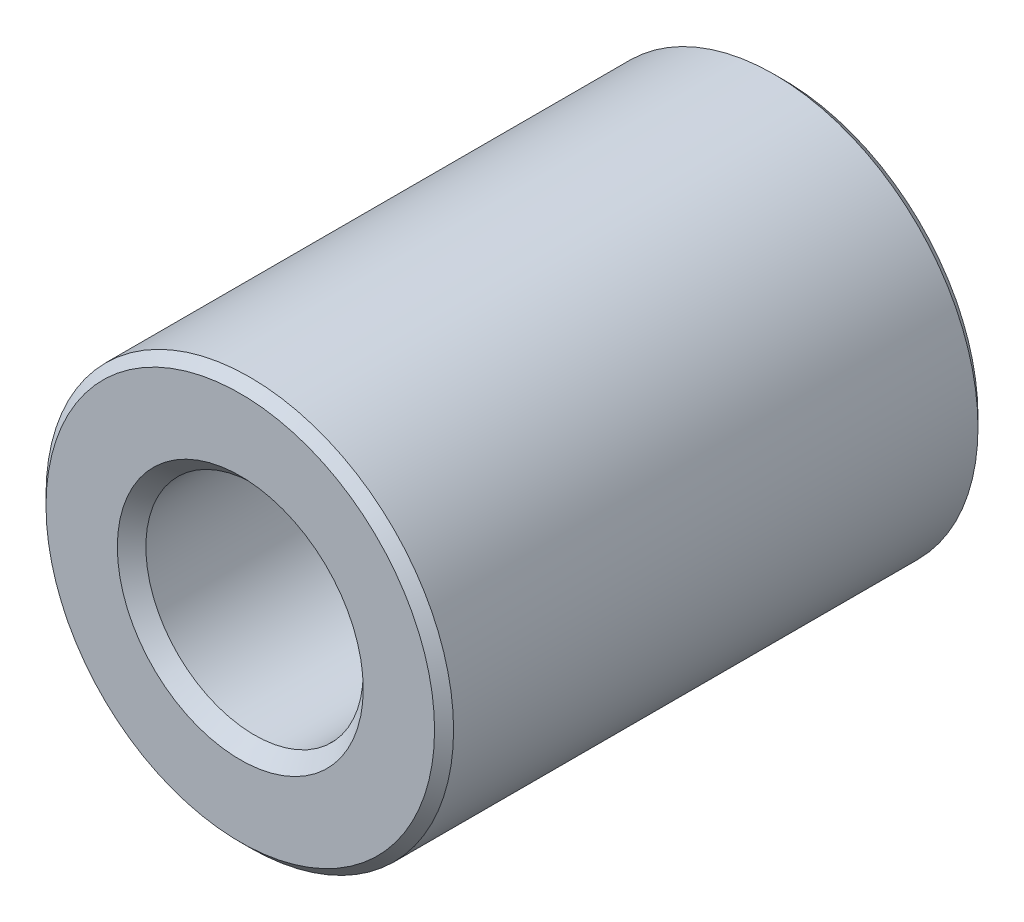
ISO-10303-21;
HEADER;
FILE_DESCRIPTION(('STEP AP214'),'2;1');
FILE_NAME('part.step','',(''),(''),'','','');
FILE_SCHEMA(('AUTOMOTIVE_DESIGN { 1 0 10303 214 1 1 1 1 }'));
ENDSEC;
DATA;
#1=APPLICATION_CONTEXT('core data for automotive mechanical design processes');
#2=APPLICATION_PROTOCOL_DEFINITION('international standard','automotive_design',2000,#1);
#3=PRODUCT_CONTEXT('',#1,'mechanical');
#4=PRODUCT('Part','Part','',(#3));
#5=PRODUCT_RELATED_PRODUCT_CATEGORY('part','',(#4));
#6=PRODUCT_DEFINITION_FORMATION('','',#4);
#7=PRODUCT_DEFINITION_CONTEXT('part definition',#1,'design');
#8=PRODUCT_DEFINITION('design','',#6,#7);
#9=PRODUCT_DEFINITION_SHAPE('','',#8);
#10=(LENGTH_UNIT() NAMED_UNIT(*) SI_UNIT(.MILLI.,.METRE.));
#11=(NAMED_UNIT(*) PLANE_ANGLE_UNIT() SI_UNIT($,.RADIAN.));
#12=(NAMED_UNIT(*) SI_UNIT($,.STERADIAN.) SOLID_ANGLE_UNIT());
#13=UNCERTAINTY_MEASURE_WITH_UNIT(LENGTH_MEASURE(1.E-05),#10,'distance_accuracy_value','');
#14=(GEOMETRIC_REPRESENTATION_CONTEXT(3) GLOBAL_UNCERTAINTY_ASSIGNED_CONTEXT((#13)) GLOBAL_UNIT_ASSIGNED_CONTEXT((#10,
#11,#12)) REPRESENTATION_CONTEXT('',''));
#15=CARTESIAN_POINT('',(0.,0.,0.));
#16=DIRECTION('',(0.,0.,1.));
#17=DIRECTION('',(1.,0.,0.));
#18=AXIS2_PLACEMENT_3D('',#15,#16,#17);
#19=CARTESIAN_POINT('',(0.,0.,-4.));
#20=DIRECTION('',(0.,0.,1.));
#21=DIRECTION('',(1.,0.,0.));
#22=AXIS2_PLACEMENT_3D('',#19,#20,#21);
#23=CYLINDRICAL_SURFACE('',#22,3.);
#24=CARTESIAN_POINT('',(0.,0.,3.86));
#25=DIRECTION('',(0.,0.,1.));
#26=DIRECTION('',(1.,0.,0.));
#27=AXIS2_PLACEMENT_3D('',#24,#25,#26);
#28=CIRCLE('',#27,3.);
#29=CARTESIAN_POINT('',(-3.,0.,3.86));
#30=VERTEX_POINT('',#29);
#31=EDGE_CURVE('E55',#30,#30,#28,.F.);
#32=ORIENTED_EDGE('',*,*,#31,.T.);
#33=EDGE_LOOP('',(#32));
#34=FACE_BOUND('',#33,.T.);
#35=CARTESIAN_POINT('',(0.,0.,-3.86));
#36=DIRECTION('',(0.,0.,1.));
#37=DIRECTION('',(1.,0.,0.));
#38=AXIS2_PLACEMENT_3D('',#35,#36,#37);
#39=CIRCLE('',#38,3.);
#40=CARTESIAN_POINT('',(3.,0.,-3.86));
#41=VERTEX_POINT('',#40);
#42=EDGE_CURVE('E58',#41,#41,#39,.T.);
#43=ORIENTED_EDGE('',*,*,#42,.T.);
#44=EDGE_LOOP('',(#43));
#45=FACE_BOUND('',#44,.T.);
#46=ADVANCED_FACE('F32',(#34,#45),#23,.T.);
#47=CARTESIAN_POINT('',(0.,0.,-4.));
#48=DIRECTION('',(0.,0.,1.));
#49=DIRECTION('',(1.,0.,0.));
#50=AXIS2_PLACEMENT_3D('',#47,#48,#49);
#51=PLANE('',#50);
#52=CARTESIAN_POINT('',(0.,0.,-4.));
#53=DIRECTION('',(0.,0.,1.));
#54=DIRECTION('',(1.,0.,0.));
#55=AXIS2_PLACEMENT_3D('',#52,#53,#54);
#56=CIRCLE('',#55,1.81);
#57=CARTESIAN_POINT('',(1.81,0.,-4.));
#58=VERTEX_POINT('',#57);
#59=EDGE_CURVE('E10',#58,#58,#56,.T.);
#60=ORIENTED_EDGE('',*,*,#59,.T.);
#61=EDGE_LOOP('',(#60));
#62=FACE_BOUND('',#61,.T.);
#63=CARTESIAN_POINT('',(0.,0.,-4.));
#64=DIRECTION('',(0.,0.,1.));
#65=DIRECTION('',(1.,0.,0.));
#66=AXIS2_PLACEMENT_3D('',#63,#64,#65);
#67=CIRCLE('',#66,2.86);
#68=CARTESIAN_POINT('',(2.86,0.,-4.));
#69=VERTEX_POINT('',#68);
#70=EDGE_CURVE('E52',#69,#69,#67,.F.);
#71=ORIENTED_EDGE('',*,*,#70,.T.);
#72=EDGE_LOOP('',(#71));
#73=FACE_BOUND('',#72,.T.);
#74=ADVANCED_FACE('F84',(#62,#73),#51,.F.);
#75=CARTESIAN_POINT('',(0.,0.,-4.));
#76=DIRECTION('',(0.,0.,1.));
#77=DIRECTION('',(1.,0.,0.));
#78=AXIS2_PLACEMENT_3D('',#75,#76,#77);
#79=CYLINDRICAL_SURFACE('',#78,1.6);
#80=CARTESIAN_POINT('',(0.,0.,3.79));
#81=DIRECTION('',(0.,0.,1.));
#82=DIRECTION('',(1.,0.,0.));
#83=AXIS2_PLACEMENT_3D('',#80,#81,#82);
#84=CIRCLE('',#83,1.6);
#85=CARTESIAN_POINT('',(1.6,0.,3.79));
#86=VERTEX_POINT('',#85);
#87=EDGE_CURVE('E43',#86,#86,#84,.T.);
#88=ORIENTED_EDGE('',*,*,#87,.T.);
#89=EDGE_LOOP('',(#88));
#90=FACE_BOUND('',#89,.T.);
#91=CARTESIAN_POINT('',(0.,0.,-3.79));
#92=DIRECTION('',(0.,0.,1.));
#93=DIRECTION('',(1.,0.,0.));
#94=AXIS2_PLACEMENT_3D('',#91,#92,#93);
#95=CIRCLE('',#94,1.6);
#96=CARTESIAN_POINT('',(1.6,0.,-3.79));
#97=VERTEX_POINT('',#96);
#98=EDGE_CURVE('E47',#97,#97,#95,.F.);
#99=ORIENTED_EDGE('',*,*,#98,.T.);
#100=EDGE_LOOP('',(#99));
#101=FACE_BOUND('',#100,.T.);
#102=ADVANCED_FACE('F79',(#90,#101),#79,.F.);
#103=CARTESIAN_POINT('',(0.,0.,4.));
#104=DIRECTION('',(0.,0.,1.));
#105=DIRECTION('',(1.,0.,0.));
#106=AXIS2_PLACEMENT_3D('',#103,#104,#105);
#107=PLANE('',#106);
#108=CARTESIAN_POINT('',(0.,0.,4.));
#109=DIRECTION('',(0.,0.,1.));
#110=DIRECTION('',(1.,0.,0.));
#111=AXIS2_PLACEMENT_3D('',#108,#109,#110);
#112=CIRCLE('',#111,1.81);
#113=CARTESIAN_POINT('',(1.81,0.,4.));
#114=VERTEX_POINT('',#113);
#115=EDGE_CURVE('E39',#114,#114,#112,.F.);
#116=ORIENTED_EDGE('',*,*,#115,.T.);
#117=EDGE_LOOP('',(#116));
#118=FACE_BOUND('',#117,.T.);
#119=CARTESIAN_POINT('',(0.,0.,4.));
#120=DIRECTION('',(0.,0.,1.));
#121=DIRECTION('',(1.,0.,0.));
#122=AXIS2_PLACEMENT_3D('',#119,#120,#121);
#123=CIRCLE('',#122,2.86);
#124=CARTESIAN_POINT('',(-2.86,0.,4.));
#125=VERTEX_POINT('',#124);
#126=EDGE_CURVE('E61',#125,#125,#123,.T.);
#127=ORIENTED_EDGE('',*,*,#126,.T.);
#128=EDGE_LOOP('',(#127));
#129=FACE_BOUND('',#128,.T.);
#130=ADVANCED_FACE('F65',(#118,#129),#107,.T.);
#131=CARTESIAN_POINT('',(0.,0.,4.));
#132=DIRECTION('',(0.,0.,-1.));
#133=DIRECTION('',(-1.,0.,0.));
#134=AXIS2_PLACEMENT_3D('',#131,#132,#133);
#135=CONICAL_SURFACE('',#134,2.86,0.785398163397439);
#136=CARTESIAN_POINT('',(-3.,0.,3.86));
#137=CARTESIAN_POINT('',(-2.99854166666667,0.,3.86145833333333));
#138=CARTESIAN_POINT('',(-2.99708333333333,0.,3.86291666666667));
#139=CARTESIAN_POINT('',(-2.99416666666667,0.,3.86583333333333));
#140=CARTESIAN_POINT('',(-2.99270833333333,0.,3.86729166666667));
#141=CARTESIAN_POINT('',(-2.98979166666667,0.,3.87020833333333));
#142=CARTESIAN_POINT('',(-2.98833333333333,0.,3.87166666666667));
#143=CARTESIAN_POINT('',(-2.98541666666667,0.,3.87458333333333));
#144=CARTESIAN_POINT('',(-2.98395833333333,0.,3.87604166666667));
#145=CARTESIAN_POINT('',(-2.98104166666667,0.,3.87895833333333));
#146=CARTESIAN_POINT('',(-2.97958333333333,0.,3.88041666666667));
#147=CARTESIAN_POINT('',(-2.97666666666667,0.,3.88333333333333));
#148=CARTESIAN_POINT('',(-2.97520833333333,0.,3.88479166666667));
#149=CARTESIAN_POINT('',(-2.97229166666667,0.,3.88770833333333));
#150=CARTESIAN_POINT('',(-2.97083333333333,0.,3.88916666666667));
#151=CARTESIAN_POINT('',(-2.96791666666667,0.,3.89208333333333));
#152=CARTESIAN_POINT('',(-2.96645833333333,0.,3.89354166666667));
#153=CARTESIAN_POINT('',(-2.96354166666667,0.,3.89645833333333));
#154=CARTESIAN_POINT('',(-2.96208333333333,0.,3.89791666666667));
#155=CARTESIAN_POINT('',(-2.95916666666667,0.,3.90083333333333));
#156=CARTESIAN_POINT('',(-2.95770833333333,0.,3.90229166666667));
#157=CARTESIAN_POINT('',(-2.95479166666667,0.,3.90520833333333));
#158=CARTESIAN_POINT('',(-2.95333333333333,0.,3.90666666666667));
#159=CARTESIAN_POINT('',(-2.95041666666667,0.,3.90958333333333));
#160=CARTESIAN_POINT('',(-2.94895833333333,0.,3.91104166666667));
#161=CARTESIAN_POINT('',(-2.94604166666667,0.,3.91395833333333));
#162=CARTESIAN_POINT('',(-2.94458333333333,0.,3.91541666666667));
#163=CARTESIAN_POINT('',(-2.94166666666667,0.,3.91833333333333));
#164=CARTESIAN_POINT('',(-2.94020833333333,0.,3.91979166666667));
#165=CARTESIAN_POINT('',(-2.93729166666667,0.,3.92270833333333));
#166=CARTESIAN_POINT('',(-2.93583333333333,0.,3.92416666666667));
#167=CARTESIAN_POINT('',(-2.93291666666667,0.,3.92708333333333));
#168=CARTESIAN_POINT('',(-2.93145833333333,0.,3.92854166666667));
#169=CARTESIAN_POINT('',(-2.92854166666667,0.,3.93145833333333));
#170=CARTESIAN_POINT('',(-2.92708333333333,0.,3.93291666666667));
#171=CARTESIAN_POINT('',(-2.92416666666667,0.,3.93583333333333));
#172=CARTESIAN_POINT('',(-2.92270833333333,0.,3.93729166666667));
#173=CARTESIAN_POINT('',(-2.91979166666667,0.,3.94020833333333));
#174=CARTESIAN_POINT('',(-2.91833333333333,0.,3.94166666666667));
#175=CARTESIAN_POINT('',(-2.91541666666667,0.,3.94458333333333));
#176=CARTESIAN_POINT('',(-2.91395833333334,0.,3.94604166666667));
#177=CARTESIAN_POINT('',(-2.91104166666667,0.,3.94895833333333));
#178=CARTESIAN_POINT('',(-2.90958333333334,0.,3.95041666666667));
#179=CARTESIAN_POINT('',(-2.90666666666667,0.,3.95333333333333));
#180=CARTESIAN_POINT('',(-2.90520833333334,0.,3.95479166666667));
#181=CARTESIAN_POINT('',(-2.90229166666667,0.,3.95770833333333));
#182=CARTESIAN_POINT('',(-2.90083333333334,0.,3.95916666666667));
#183=CARTESIAN_POINT('',(-2.89791666666667,0.,3.96208333333333));
#184=CARTESIAN_POINT('',(-2.89645833333334,0.,3.96354166666667));
#185=CARTESIAN_POINT('',(-2.89354166666667,0.,3.96645833333333));
#186=CARTESIAN_POINT('',(-2.89208333333334,0.,3.96791666666667));
#187=CARTESIAN_POINT('',(-2.88916666666667,0.,3.97083333333333));
#188=CARTESIAN_POINT('',(-2.88770833333334,0.,3.97229166666667));
#189=CARTESIAN_POINT('',(-2.88479166666667,0.,3.97520833333333));
#190=CARTESIAN_POINT('',(-2.88333333333334,0.,3.97666666666667));
#191=CARTESIAN_POINT('',(-2.88041666666667,0.,3.97958333333333));
#192=CARTESIAN_POINT('',(-2.87895833333334,0.,3.98104166666667));
#193=CARTESIAN_POINT('',(-2.87604166666667,0.,3.98395833333333));
#194=CARTESIAN_POINT('',(-2.87458333333334,0.,3.98541666666667));
#195=CARTESIAN_POINT('',(-2.87166666666667,0.,3.98833333333333));
#196=CARTESIAN_POINT('',(-2.87020833333334,0.,3.98979166666667));
#197=CARTESIAN_POINT('',(-2.86729166666667,0.,3.99270833333333));
#198=CARTESIAN_POINT('',(-2.86583333333334,0.,3.99416666666667));
#199=CARTESIAN_POINT('',(-2.86291666666667,0.,3.99708333333333));
#200=CARTESIAN_POINT('',(-2.86145833333334,0.,3.99854166666667));
#201=CARTESIAN_POINT('',(-2.86,0.,4.));
#202=B_SPLINE_CURVE_WITH_KNOTS('',3,(#136,#137,#138,#139,#140,#141,#142,#143,#144,#145,#146,
#147,#148,#149,#150,#151,#152,#153,#154,#155,#156,#157,#158,#159,#160,#161,#162,#163,#164,#165,
#166,#167,#168,#169,#170,#171,#172,#173,#174,#175,#176,#177,#178,#179,#180,#181,#182,#183,#184,
#185,#186,#187,#188,#189,#190,#191,#192,#193,#194,#195,#196,#197,#198,#199,#200,#201),
.UNSPECIFIED.,.F.,.F.,(4,2,2,2,2,2,2,2,2,2,2,2,2,2,2,2,2,2,2,2,2,2,2,2,2,2,2,2,2,2,2,2,4),(0.,
0.00618718433538235,0.0123743686707647,0.018561553006147,0.0247487373415294,0.0309359216769114,
0.0371231060122938,0.0433102903476761,0.0494974746830585,0.0556846590184408,0.0618718433538228,
0.0680590276892055,0.0742462120245878,0.0804333963599702,0.0866205806953525,0.0928077650307346,
0.0989949493661169,0.105182133701499,0.111369318036882,0.117556502372264,0.123743686707646,
0.129930871043028,0.136118055378411,0.142305239713793,0.148492424049175,0.154679608384557,
0.16086679271994,0.167053977055322,0.173241161390704,0.179428345726087,0.185615530061469,
0.191802714396851,0.197989898732234),.UNSPECIFIED.);
#203=EDGE_CURVE('BSEAM67',#30,#125,#202,.T.);
#204=ORIENTED_EDGE('',*,*,#31,.F.);
#205=ORIENTED_EDGE('',*,*,#126,.F.);
#206=ORIENTED_EDGE('',*,*,#203,.T.);
#207=ORIENTED_EDGE('',*,*,#203,.F.);
#208=EDGE_LOOP('',(#204,#206,#205,#207));
#209=FACE_BOUND('',#208,.T.);
#210=ADVANCED_FACE('F67',(#209),#135,.T.);
#211=CARTESIAN_POINT('',(0.,0.,-3.86));
#212=DIRECTION('',(0.,0.,1.));
#213=DIRECTION('',(1.,0.,0.));
#214=AXIS2_PLACEMENT_3D('',#211,#212,#213);
#215=CONICAL_SURFACE('',#214,3.,0.785398163397451);
#216=ORIENTED_EDGE('',*,*,#70,.F.);
#217=EDGE_LOOP('',(#216));
#218=FACE_BOUND('',#217,.T.);
#219=ORIENTED_EDGE('',*,*,#42,.F.);
#220=EDGE_LOOP('',(#219));
#221=FACE_BOUND('',#220,.T.);
#222=ADVANCED_FACE('F69',(#218,#221),#215,.T.);
#223=CARTESIAN_POINT('',(0.,0.,3.79));
#224=DIRECTION('',(0.,0.,1.));
#225=DIRECTION('',(1.,0.,0.));
#226=AXIS2_PLACEMENT_3D('',#223,#224,#225);
#227=CONICAL_SURFACE('',#226,1.6,0.78539816339745);
#228=ORIENTED_EDGE('',*,*,#115,.F.);
#229=EDGE_LOOP('',(#228));
#230=FACE_BOUND('',#229,.T.);
#231=ORIENTED_EDGE('',*,*,#87,.F.);
#232=EDGE_LOOP('',(#231));
#233=FACE_BOUND('',#232,.T.);
#234=ADVANCED_FACE('F76',(#230,#233),#227,.F.);
#235=CARTESIAN_POINT('',(0.,0.,-4.));
#236=DIRECTION('',(0.,0.,-1.));
#237=DIRECTION('',(-1.,0.,0.));
#238=AXIS2_PLACEMENT_3D('',#235,#236,#237);
#239=CONICAL_SURFACE('',#238,1.81,0.785398163397445);
#240=ORIENTED_EDGE('',*,*,#98,.F.);
#241=EDGE_LOOP('',(#240));
#242=FACE_BOUND('',#241,.T.);
#243=ORIENTED_EDGE('',*,*,#59,.F.);
#244=EDGE_LOOP('',(#243));
#245=FACE_BOUND('',#244,.T.);
#246=ADVANCED_FACE('F34',(#242,#245),#239,.F.);
#247=CLOSED_SHELL('',(#46,#74,#102,#130,#210,#222,#234,#246));
#248=MANIFOLD_SOLID_BREP('B2',#247);
#249=ADVANCED_BREP_SHAPE_REPRESENTATION('',(#18,#248),#14);
#250=SHAPE_DEFINITION_REPRESENTATION(#9,#249);
ENDSEC;
END-ISO-10303-21;
